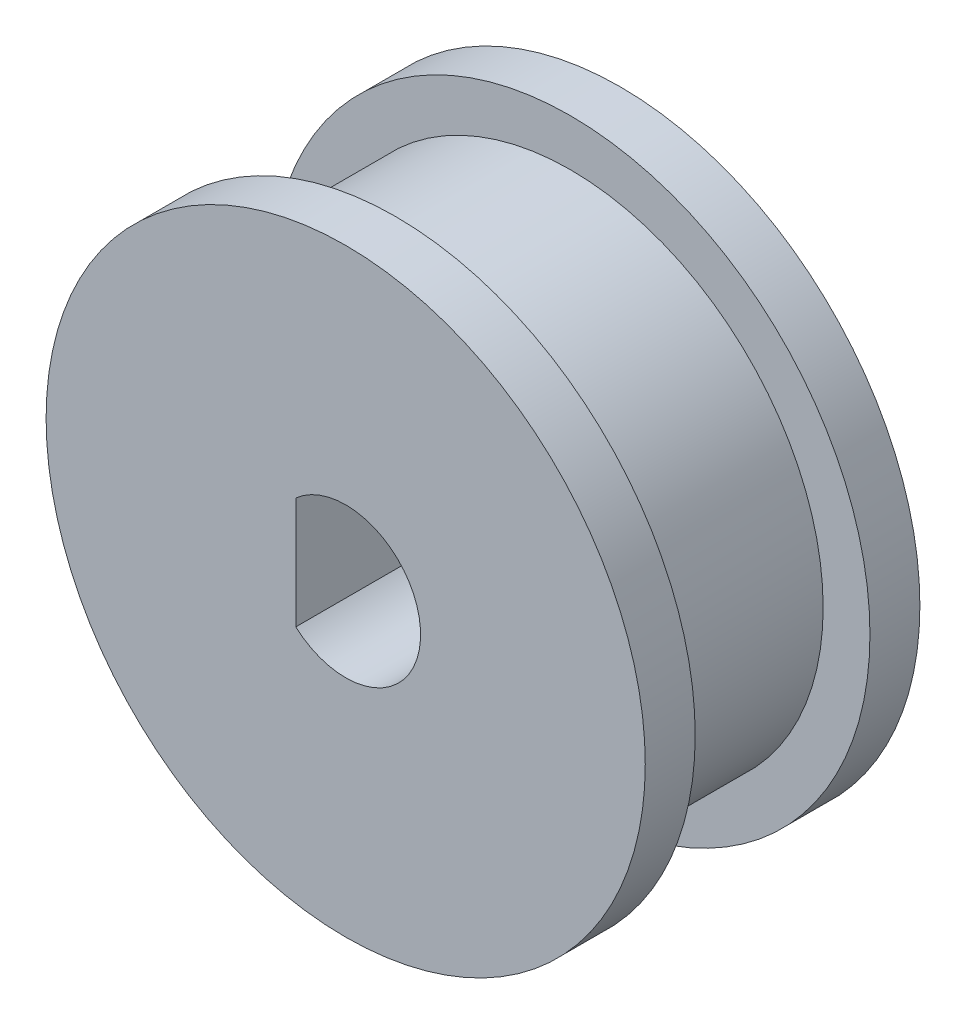
ISO-10303-21;
HEADER;
FILE_DESCRIPTION(('STEP AP214'),'2;1');
FILE_NAME('part.step','',(''),(''),'','','');
FILE_SCHEMA(('AUTOMOTIVE_DESIGN { 1 0 10303 214 1 1 1 1 }'));
ENDSEC;
DATA;
#1=APPLICATION_CONTEXT('core data for automotive mechanical design processes');
#2=APPLICATION_PROTOCOL_DEFINITION('international standard','automotive_design',2000,#1);
#3=PRODUCT_CONTEXT('',#1,'mechanical');
#4=PRODUCT('Part','Part','',(#3));
#5=PRODUCT_RELATED_PRODUCT_CATEGORY('part','',(#4));
#6=PRODUCT_DEFINITION_FORMATION('','',#4);
#7=PRODUCT_DEFINITION_CONTEXT('part definition',#1,'design');
#8=PRODUCT_DEFINITION('design','',#6,#7);
#9=PRODUCT_DEFINITION_SHAPE('','',#8);
#10=(LENGTH_UNIT() NAMED_UNIT(*) SI_UNIT(.MILLI.,.METRE.));
#11=(NAMED_UNIT(*) PLANE_ANGLE_UNIT() SI_UNIT($,.RADIAN.));
#12=(NAMED_UNIT(*) SI_UNIT($,.STERADIAN.) SOLID_ANGLE_UNIT());
#13=UNCERTAINTY_MEASURE_WITH_UNIT(LENGTH_MEASURE(1.E-05),#10,'distance_accuracy_value','');
#14=(GEOMETRIC_REPRESENTATION_CONTEXT(3) GLOBAL_UNCERTAINTY_ASSIGNED_CONTEXT((#13)) GLOBAL_UNIT_ASSIGNED_CONTEXT((#10,
#11,#12)) REPRESENTATION_CONTEXT('',''));
#15=CARTESIAN_POINT('',(0.,0.,0.));
#16=DIRECTION('',(0.,0.,1.));
#17=DIRECTION('',(1.,0.,0.));
#18=AXIS2_PLACEMENT_3D('',#15,#16,#17);
#19=CARTESIAN_POINT('',(0.,0.,3.5));
#20=DIRECTION('',(0.,0.,-1.));
#21=DIRECTION('',(-1.,0.,0.));
#22=AXIS2_PLACEMENT_3D('',#19,#20,#21);
#23=CYLINDRICAL_SURFACE('',#22,10.125);
#24=CARTESIAN_POINT('',(0.,-10.125,1.5));
#25=CARTESIAN_POINT('',(0.0837638113652493,-10.1249986690809,1.4999965364608));
#26=CARTESIAN_POINT('',(0.167576527266674,-10.1239496365079,1.49295993930032));
#27=CARTESIAN_POINT('',(0.332860107909288,-10.1198657946306,1.46500611770191));
#28=CARTESIAN_POINT('',(0.414328597579588,-10.1168290406185,1.44407529942512));
#29=CARTESIAN_POINT('',(0.572507755255597,-10.1091110862003,1.38897147390049));
#30=CARTESIAN_POINT('',(0.649221938171266,-10.1044311181231,1.35480838822025));
#31=CARTESIAN_POINT('',(0.795816796864536,-10.0939441396108,1.27423384307133));
#32=CARTESIAN_POINT('',(0.865698437520783,-10.0881372886587,1.2278241164839));
#33=CARTESIAN_POINT('',(0.997189526627415,-10.0759929611263,1.12369640264024));
#34=CARTESIAN_POINT('',(1.05873930827636,-10.0696521357657,1.06590345157246));
#35=CARTESIAN_POINT('',(1.17130478357067,-10.0571807833803,0.940811114197306));
#36=CARTESIAN_POINT('',(1.22231987716081,-10.0510502683515,0.873511186740605));
#37=CARTESIAN_POINT('',(1.31259935386314,-10.0396611330402,0.730915392536569));
#38=CARTESIAN_POINT('',(1.35180614707092,-10.034406839944,0.655582689202163));
#39=CARTESIAN_POINT('',(1.41698807406035,-10.0254106709424,0.49931062237877));
#40=CARTESIAN_POINT('',(1.44296391115152,-10.0216687146488,0.418371557163469));
#41=CARTESIAN_POINT('',(1.48076156498896,-10.0161537544874,0.253811248545279));
#42=CARTESIAN_POINT('',(1.49268543046269,-10.014366561579,0.170213928763024));
#43=CARTESIAN_POINT('',(1.50235677490334,-10.0129203791319,0.0021873130000883));
#44=CARTESIAN_POINT('',(1.50010504814121,-10.0132612703549,-0.0822419361022005));
#45=CARTESIAN_POINT('',(1.48157255204166,-10.01601976372,-0.248815669839024));
#46=CARTESIAN_POINT('',(1.46540533937245,-10.0184205556408,-0.330973106886233));
#47=CARTESIAN_POINT('',(1.41967851394471,-10.0250020854776,-0.491396128531784));
#48=CARTESIAN_POINT('',(1.39011853084709,-10.0291828726143,-0.569661605442587));
#49=CARTESIAN_POINT('',(1.31832684277617,-10.0388719316315,-0.720425121572834));
#50=CARTESIAN_POINT('',(1.27604693873346,-10.0443852368588,-0.79289987227854));
#51=CARTESIAN_POINT('',(1.18004991824751,-10.0561144642231,-0.929769053908086));
#52=CARTESIAN_POINT('',(1.12633206930943,-10.062330431347,-0.994162966908862));
#53=CARTESIAN_POINT('',(1.00836020058881,-10.0748389100312,-1.11370077783855));
#54=CARTESIAN_POINT('',(0.944008528396183,-10.0811315768469,-1.16874833202088));
#55=CARTESIAN_POINT('',(0.806928817458435,-10.0930280937204,-1.26727679323804));
#56=CARTESIAN_POINT('',(0.734200743644141,-10.0986319408942,-1.31075765184448));
#57=CARTESIAN_POINT('',(0.582349940447671,-10.1085250657243,-1.38492302245964));
#58=CARTESIAN_POINT('',(0.503223583282308,-10.1128135909035,-1.41560021327832));
#59=CARTESIAN_POINT('',(0.340864562425471,-10.1195865436355,-1.46320426122492));
#60=CARTESIAN_POINT('',(0.257632169847543,-10.1220710901317,-1.48013202491527));
#61=CARTESIAN_POINT('',(0.0902553766461194,-10.1249404149419,-1.49962885014899));
#62=CARTESIAN_POINT('',(0.00612672701644951,-10.1253445650426,-1.50233038587268));
#63=CARTESIAN_POINT('',(-0.161382384311351,-10.124060257838,-1.49364953410334));
#64=CARTESIAN_POINT('',(-0.244762868510274,-10.1223718636791,-1.48226757160584));
#65=CARTESIAN_POINT('',(-0.408008347122321,-10.117104163241,-1.44585296693453));
#66=CARTESIAN_POINT('',(-0.48788802662934,-10.1135337844542,-1.42088475536892));
#67=CARTESIAN_POINT('',(-0.642327306139718,-10.104901202049,-1.35807427665211));
#68=CARTESIAN_POINT('',(-0.71688666143652,-10.0998389298664,-1.32023141779688));
#69=CARTESIAN_POINT('',(-0.859152078466383,-10.0887371031823,-1.23243429509029));
#70=CARTESIAN_POINT('',(-0.926805666324396,-10.0826908586488,-1.18239586461557));
#71=CARTESIAN_POINT('',(-1.05280223392081,-10.0703151842522,-1.07174533800946));
#72=CARTESIAN_POINT('',(-1.11114468616479,-10.0639857383712,-1.01113264323176));
#73=CARTESIAN_POINT('',(-1.21734392495725,-10.0516957340842,-0.880464892598861));
#74=CARTESIAN_POINT('',(-1.26511198559047,-10.0457385774643,-0.810337356934592));
#75=CARTESIAN_POINT('',(-1.3481900599821,-10.0349275575465,-0.662976058004377));
#76=CARTESIAN_POINT('',(-1.38350040380324,-10.0300736650192,-0.585742483078749));
#77=CARTESIAN_POINT('',(-1.4405227057952,-10.0220432667678,-0.426627788295707));
#78=CARTESIAN_POINT('',(-1.46228162102523,-10.0188609748515,-0.344763801418272));
#79=CARTESIAN_POINT('',(-1.491733012766,-10.0145186092197,-0.178492869335527));
#80=CARTESIAN_POINT('',(-1.49942643478559,-10.0133583995762,-0.0940860954488826));
#81=CARTESIAN_POINT('',(-1.50050636915554,-10.0131965509632,0.0739901993020562));
#82=CARTESIAN_POINT('',(-1.49403237740492,-10.0141738653447,0.157658837065951));
#83=CARTESIAN_POINT('',(-1.46725990660619,-10.0181312446972,0.322703535168193));
#84=CARTESIAN_POINT('',(-1.44696144756782,-10.0211113067694,0.404079598824667));
#85=CARTESIAN_POINT('',(-1.3931651240166,-10.028731113209,0.562192133156529));
#86=CARTESIAN_POINT('',(-1.35967677019156,-10.0333696614888,0.638931900988818));
#87=CARTESIAN_POINT('',(-1.28046512251875,-10.0437852862523,0.7857262286719));
#88=CARTESIAN_POINT('',(-1.23474143492849,-10.0495623993743,0.855780573282172));
#89=CARTESIAN_POINT('',(-1.13184934701868,-10.0616719775735,0.98792457768452));
#90=CARTESIAN_POINT('',(-1.07457756951678,-10.0680091456143,1.04993332231593));
#91=CARTESIAN_POINT('',(-0.950433442596111,-10.0804853489398,1.16350978760627));
#92=CARTESIAN_POINT('',(-0.883558862617147,-10.0866243377841,1.2150750757095));
#93=CARTESIAN_POINT('',(-0.741686222732159,-10.0980500096474,1.30654714772199));
#94=CARTESIAN_POINT('',(-0.666646526866731,-10.103331946029,1.34638993522944));
#95=CARTESIAN_POINT('',(-0.510897957359262,-10.1124017542597,1.41284709898553));
#96=CARTESIAN_POINT('',(-0.43019507876428,-10.1161911787901,1.43947523016839));
#97=CARTESIAN_POINT('',(-0.290937991142248,-10.1209800941738,1.47267944614035));
#98=CARTESIAN_POINT('',(-0.233244968095915,-10.1224798489464,1.48290907213627));
#99=CARTESIAN_POINT('',(-0.117042583639427,-10.1244902609544,1.49657051851406));
#100=CARTESIAN_POINT('',(-0.0585332320113895,-10.1250009300317,1.50000242028318));
#101=CARTESIAN_POINT('',(0.,-10.125,1.5));
#102=B_SPLINE_CURVE_WITH_KNOTS('',3,(#24,#25,#26,#27,#28,#29,#30,#31,#32,#33,#34,#35,#36,#37,
#38,#39,#40,#41,#42,#43,#44,#45,#46,#47,#48,#49,#50,#51,#52,#53,#54,#55,#56,#57,#58,#59,#60,#61,
#62,#63,#64,#65,#66,#67,#68,#69,#70,#71,#72,#73,#74,#75,#76,#77,#78,#79,#80,#81,#82,#83,#84,#85,
#86,#87,#88,#89,#90,#91,#92,#93,#94,#95,#96,#97,#98,#99,#100,#101),.UNSPECIFIED.,.T.,.F.,(4,2,2,
2,2,2,2,2,2,2,2,2,2,2,2,2,2,2,2,2,2,2,2,2,2,2,2,2,2,2,2,2,2,2,2,2,2,2,4),(0.,0.251077554142502,
0.502401120508755,0.753536607868805,1.00463657897284,1.25744905426896,1.51027592577958,
1.76431659567471,2.01834376028179,2.27051452323561,2.5226711569646,2.77278937913918,
3.02291451804595,3.27399964581028,3.52510085809927,3.77865113545417,4.03220247437744,
4.28589859702827,4.53957799097868,4.79089089882474,5.0421962230253,5.29232002885766,
5.54245533164653,5.79436839552578,6.04629572572106,6.30026287771631,6.55422330043787,
6.80729875596697,7.06035719866375,7.31093518488099,7.56151280840874,7.81191008058056,
8.06231541169914,8.31507069785246,8.56788478982094,8.82205449054497,9.07595907208052,
9.25141141180508,9.42686165087542),.UNSPECIFIED.);
#103=CARTESIAN_POINT('',(0.,-10.125,1.5));
#104=VERTEX_POINT('',#103);
#105=EDGE_CURVE('E84',#104,#104,#102,.T.);
#106=ORIENTED_EDGE('',*,*,#105,.T.);
#107=EDGE_LOOP('',(#106));
#108=FACE_BOUND('',#107,.T.);
#109=CARTESIAN_POINT('',(0.,0.,3.5));
#110=DIRECTION('',(0.,0.,1.));
#111=DIRECTION('',(1.,0.,0.));
#112=AXIS2_PLACEMENT_3D('',#109,#110,#111);
#113=CIRCLE('',#112,10.125);
#114=CARTESIAN_POINT('',(10.125,0.,3.5));
#115=VERTEX_POINT('',#114);
#116=EDGE_CURVE('E11',#115,#115,#113,.T.);
#117=ORIENTED_EDGE('',*,*,#116,.F.);
#118=EDGE_LOOP('',(#117));
#119=FACE_BOUND('',#118,.T.);
#120=CARTESIAN_POINT('',(0.,0.,-3.5));
#121=DIRECTION('',(0.,0.,1.));
#122=DIRECTION('',(1.,0.,0.));
#123=AXIS2_PLACEMENT_3D('',#120,#121,#122);
#124=CIRCLE('',#123,10.125);
#125=CARTESIAN_POINT('',(10.125,0.,-3.5));
#126=VERTEX_POINT('',#125);
#127=EDGE_CURVE('E96',#126,#126,#124,.T.);
#128=ORIENTED_EDGE('',*,*,#127,.T.);
#129=EDGE_LOOP('',(#128));
#130=FACE_BOUND('',#129,.T.);
#131=ADVANCED_FACE('F36',(#108,#119,#130),#23,.T.);
#132=CARTESIAN_POINT('',(0.,0.,5.5));
#133=DIRECTION('',(0.,0.,-1.));
#134=DIRECTION('',(-1.,0.,0.));
#135=AXIS2_PLACEMENT_3D('',#132,#133,#134);
#136=CYLINDRICAL_SURFACE('',#135,12.);
#137=CARTESIAN_POINT('',(0.,0.,5.5));
#138=DIRECTION('',(0.,0.,1.));
#139=DIRECTION('',(1.,0.,0.));
#140=AXIS2_PLACEMENT_3D('',#137,#138,#139);
#141=CIRCLE('',#140,12.);
#142=CARTESIAN_POINT('',(12.,0.,5.5));
#143=VERTEX_POINT('',#142);
#144=EDGE_CURVE('E50',#143,#143,#141,.T.);
#145=ORIENTED_EDGE('',*,*,#144,.F.);
#146=EDGE_LOOP('',(#145));
#147=FACE_BOUND('',#146,.T.);
#148=CARTESIAN_POINT('',(0.,0.,3.5));
#149=DIRECTION('',(0.,0.,1.));
#150=DIRECTION('',(1.,0.,0.));
#151=AXIS2_PLACEMENT_3D('',#148,#149,#150);
#152=CIRCLE('',#151,12.);
#153=CARTESIAN_POINT('',(12.,0.,3.5));
#154=VERTEX_POINT('',#153);
#155=EDGE_CURVE('E101',#154,#154,#152,.T.);
#156=ORIENTED_EDGE('',*,*,#155,.T.);
#157=EDGE_LOOP('',(#156));
#158=FACE_BOUND('',#157,.T.);
#159=ADVANCED_FACE('F129',(#147,#158),#136,.T.);
#160=CARTESIAN_POINT('',(0.,0.,5.5));
#161=DIRECTION('',(0.,0.,1.));
#162=DIRECTION('',(1.,0.,0.));
#163=AXIS2_PLACEMENT_3D('',#160,#161,#162);
#164=PLANE('',#163);
#165=CARTESIAN_POINT('',(0.,0.,5.5));
#166=DIRECTION('',(0.,0.,1.));
#167=DIRECTION('',(1.,0.,0.));
#168=AXIS2_PLACEMENT_3D('',#165,#166,#167);
#169=CIRCLE('',#168,3.);
#170=CARTESIAN_POINT('',(-2.,-2.23606797749979,5.5));
#171=VERTEX_POINT('',#170);
#172=CARTESIAN_POINT('',(-2.,2.23606797749979,5.5));
#173=VERTEX_POINT('',#172);
#174=EDGE_CURVE('E58',#171,#173,#169,.T.);
#175=ORIENTED_EDGE('',*,*,#174,.F.);
#176=DIRECTION('',(0.,-1.,0.));
#177=VECTOR('',#176,1.);
#178=CARTESIAN_POINT('',(-2.,2.23606797749979,5.5));
#179=LINE('',#178,#177);
#180=EDGE_CURVE('E78',#173,#171,#179,.T.);
#181=ORIENTED_EDGE('',*,*,#180,.F.);
#182=EDGE_LOOP('',(#175,#181));
#183=FACE_BOUND('',#182,.T.);
#184=ORIENTED_EDGE('',*,*,#144,.T.);
#185=EDGE_LOOP('',(#184));
#186=FACE_BOUND('',#185,.T.);
#187=ADVANCED_FACE('F82',(#183,#186),#164,.T.);
#188=CARTESIAN_POINT('',(0.,0.,3.5));
#189=DIRECTION('',(0.,0.,1.));
#190=DIRECTION('',(1.,0.,0.));
#191=AXIS2_PLACEMENT_3D('',#188,#189,#190);
#192=PLANE('',#191);
#193=ORIENTED_EDGE('',*,*,#116,.T.);
#194=EDGE_LOOP('',(#193));
#195=FACE_BOUND('',#194,.T.);
#196=ORIENTED_EDGE('',*,*,#155,.F.);
#197=EDGE_LOOP('',(#196));
#198=FACE_BOUND('',#197,.T.);
#199=ADVANCED_FACE('F116',(#195,#198),#192,.F.);
#200=CARTESIAN_POINT('',(0.,0.,-5.5));
#201=DIRECTION('',(0.,0.,1.));
#202=DIRECTION('',(1.,0.,0.));
#203=AXIS2_PLACEMENT_3D('',#200,#201,#202);
#204=CYLINDRICAL_SURFACE('',#203,12.);
#205=CARTESIAN_POINT('',(0.,0.,-5.5));
#206=DIRECTION('',(0.,0.,1.));
#207=DIRECTION('',(1.,0.,0.));
#208=AXIS2_PLACEMENT_3D('',#205,#206,#207);
#209=CIRCLE('',#208,12.);
#210=CARTESIAN_POINT('',(12.,0.,-5.5));
#211=VERTEX_POINT('',#210);
#212=EDGE_CURVE('E93',#211,#211,#209,.T.);
#213=ORIENTED_EDGE('',*,*,#212,.T.);
#214=EDGE_LOOP('',(#213));
#215=FACE_BOUND('',#214,.T.);
#216=CARTESIAN_POINT('',(0.,0.,-3.5));
#217=DIRECTION('',(0.,0.,1.));
#218=DIRECTION('',(1.,0.,0.));
#219=AXIS2_PLACEMENT_3D('',#216,#217,#218);
#220=CIRCLE('',#219,12.);
#221=CARTESIAN_POINT('',(12.,0.,-3.5));
#222=VERTEX_POINT('',#221);
#223=EDGE_CURVE('E74',#222,#222,#220,.T.);
#224=ORIENTED_EDGE('',*,*,#223,.F.);
#225=EDGE_LOOP('',(#224));
#226=FACE_BOUND('',#225,.T.);
#227=ADVANCED_FACE('F114',(#215,#226),#204,.T.);
#228=CARTESIAN_POINT('',(0.,0.,-5.5));
#229=DIRECTION('',(0.,0.,-1.));
#230=DIRECTION('',(1.,0.,0.));
#231=AXIS2_PLACEMENT_3D('',#228,#229,#230);
#232=PLANE('',#231);
#233=CARTESIAN_POINT('',(0.,0.,-5.5));
#234=DIRECTION('',(0.,0.,1.));
#235=DIRECTION('',(1.,0.,0.));
#236=AXIS2_PLACEMENT_3D('',#233,#234,#235);
#237=CIRCLE('',#236,3.);
#238=CARTESIAN_POINT('',(-2.,-2.23606797749979,-5.5));
#239=VERTEX_POINT('',#238);
#240=CARTESIAN_POINT('',(-2.,2.23606797749979,-5.5));
#241=VERTEX_POINT('',#240);
#242=EDGE_CURVE('E63',#239,#241,#237,.T.);
#243=ORIENTED_EDGE('',*,*,#242,.T.);
#244=DIRECTION('',(0.,-1.,0.));
#245=VECTOR('',#244,1.);
#246=CARTESIAN_POINT('',(-2.,2.23606797749979,-5.5));
#247=LINE('',#246,#245);
#248=EDGE_CURVE('E89',#241,#239,#247,.T.);
#249=ORIENTED_EDGE('',*,*,#248,.T.);
#250=EDGE_LOOP('',(#243,#249));
#251=FACE_BOUND('',#250,.T.);
#252=ORIENTED_EDGE('',*,*,#212,.F.);
#253=EDGE_LOOP('',(#252));
#254=FACE_BOUND('',#253,.T.);
#255=ADVANCED_FACE('F110',(#251,#254),#232,.T.);
#256=CARTESIAN_POINT('',(0.,0.,-3.5));
#257=DIRECTION('',(0.,0.,-1.));
#258=DIRECTION('',(1.,0.,0.));
#259=AXIS2_PLACEMENT_3D('',#256,#257,#258);
#260=PLANE('',#259);
#261=ORIENTED_EDGE('',*,*,#127,.F.);
#262=EDGE_LOOP('',(#261));
#263=FACE_BOUND('',#262,.T.);
#264=ORIENTED_EDGE('',*,*,#223,.T.);
#265=EDGE_LOOP('',(#264));
#266=FACE_BOUND('',#265,.T.);
#267=ADVANCED_FACE('F107',(#263,#266),#260,.F.);
#268=CARTESIAN_POINT('',(0.,0.,-5.5));
#269=DIRECTION('',(0.,0.,1.));
#270=DIRECTION('',(1.,0.,0.));
#271=AXIS2_PLACEMENT_3D('',#268,#269,#270);
#272=CYLINDRICAL_SURFACE('',#271,3.);
#273=CARTESIAN_POINT('',(0.,-3.,1.5));
#274=CARTESIAN_POINT('',(-0.0788579444268501,-2.99999570107562,1.49999504652421));
#275=CARTESIAN_POINT('',(-0.157809899546344,-2.99685736529635,1.49374489031842));
#276=CARTESIAN_POINT('',(-0.313380352903344,-2.98461234055736,1.46902067948769));
#277=CARTESIAN_POINT('',(-0.389994130070444,-2.97549431743379,1.45052341050328));
#278=CARTESIAN_POINT('',(-0.538400317320673,-2.95224419105063,1.40220928707506));
#279=CARTESIAN_POINT('',(-0.610210204408719,-2.93813158766306,1.37243642362805));
#280=CARTESIAN_POINT('',(-0.747708925209898,-2.90618664773642,1.30264406795252));
#281=CARTESIAN_POINT('',(-0.813398240985088,-2.88835460450288,1.2626253836267));
#282=CARTESIAN_POINT('',(-0.941261726642863,-2.84934387387093,1.17072412577207));
#283=CARTESIAN_POINT('',(-1.00298281668316,-2.82802798691306,1.11827028114054));
#284=CARTESIAN_POINT('',(-1.11716916730047,-2.78489955370115,1.00421778112945));
#285=CARTESIAN_POINT('',(-1.16962737466015,-2.76308664313552,0.942612222341339));
#286=CARTESIAN_POINT('',(-1.26787800067542,-2.71948426796021,0.806274975714929));
#287=CARTESIAN_POINT('',(-1.31283800332746,-2.69782780455198,0.730895852481132));
#288=CARTESIAN_POINT('',(-1.38925234033604,-2.65928968158481,0.572448996020679));
#289=CARTESIAN_POINT('',(-1.4207163224495,-2.64240461410484,0.489386806915877));
#290=CARTESIAN_POINT('',(-1.46719866328288,-2.61686800556713,0.323002341867117));
#291=CARTESIAN_POINT('',(-1.48308878562066,-2.6077840737557,0.23999332189891));
#292=CARTESIAN_POINT('',(-1.50064048996327,-2.59772834922792,0.0720317433307853));
#293=CARTESIAN_POINT('',(-1.50231613255961,-2.59674854014932,-0.0129188113067316));
#294=CARTESIAN_POINT('',(-1.49203093075844,-2.60266395385873,-0.171429036473052));
#295=CARTESIAN_POINT('',(-1.48167683930523,-2.6086314549302,-0.245136046834575));
#296=CARTESIAN_POINT('',(-1.4504097735854,-2.62614343100776,-0.389582864059563));
#297=CARTESIAN_POINT('',(-1.42949343584648,-2.63768968247664,-0.460321717957974));
#298=CARTESIAN_POINT('',(-1.37731467057901,-2.66531214619112,-0.598843698848489));
#299=CARTESIAN_POINT('',(-1.34582260067399,-2.68148760995998,-0.666519598178684));
#300=CARTESIAN_POINT('',(-1.273562531502,-2.71655106422106,-0.795951438885013));
#301=CARTESIAN_POINT('',(-1.2327903657187,-2.73544027170286,-0.857704703400134));
#302=CARTESIAN_POINT('',(-1.13709908236918,-2.77669736854929,-0.98178187911484));
#303=CARTESIAN_POINT('',(-1.08104168755392,-2.79920265355119,-1.04318531036424));
#304=CARTESIAN_POINT('',(-0.95933336811206,-2.84321434950611,-1.15610312788635));
#305=CARTESIAN_POINT('',(-0.893677884861428,-2.86472027938201,-1.20761278805082));
#306=CARTESIAN_POINT('',(-0.750774758747772,-2.90552980924446,-1.30152849154459));
#307=CARTESIAN_POINT('',(-0.673130387399113,-2.92468476243011,-1.34340070866861));
#308=CARTESIAN_POINT('',(-0.510699323233194,-2.95736821681863,-1.41314554356451));
#309=CARTESIAN_POINT('',(-0.425918364397913,-2.9709011841533,-1.44102927752275));
#310=CARTESIAN_POINT('',(-0.259149737491053,-2.98986500612153,-1.47971310557502));
#311=CARTESIAN_POINT('',(-0.177512295822489,-2.99587407451965,-1.49173685362017));
#312=CARTESIAN_POINT('',(-0.0131693999240273,-3.00109520188655,-1.50219709670173));
#313=CARTESIAN_POINT('',(0.0695355298048633,-3.00031048081978,-1.5006400284592));
#314=CARTESIAN_POINT('',(0.22684945797898,-2.99236788380153,-1.48468996737188));
#315=CARTESIAN_POINT('',(0.301589112074895,-2.98570868532253,-1.47130120090501));
#316=CARTESIAN_POINT('',(0.447610338452911,-2.9673325697226,-1.43364289215732));
#317=CARTESIAN_POINT('',(0.51889152853663,-2.95561509501618,-1.40937215031976));
#318=CARTESIAN_POINT('',(0.658332912674359,-2.92776377120382,-1.35000230035045));
#319=CARTESIAN_POINT('',(0.726345595508705,-2.91151322654446,-1.31461342482557));
#320=CARTESIAN_POINT('',(0.855692042548907,-2.87615961476126,-1.23433869653015));
#321=CARTESIAN_POINT('',(0.917022944664887,-2.85705533350408,-1.18944879810691));
#322=CARTESIAN_POINT('',(1.03765153393382,-2.81562332004297,-1.08635936200393));
#323=CARTESIAN_POINT('',(1.09615811672854,-2.79316327265249,-1.02728569733228));
#324=CARTESIAN_POINT('',(1.20278448167828,-2.7489358741323,-0.900112273083409));
#325=CARTESIAN_POINT('',(1.25089707856781,-2.72716901100071,-0.832006321728121));
#326=CARTESIAN_POINT('',(1.33756187171853,-2.68576788309734,-0.684534518740537));
#327=CARTESIAN_POINT('',(1.37553824370037,-2.66628794383591,-0.604783100858278));
#328=CARTESIAN_POINT('',(1.43712423890206,-2.63361108441202,-0.438734898637552));
#329=CARTESIAN_POINT('',(1.46075237380052,-2.62040607332625,-0.352446710299665));
#330=CARTESIAN_POINT('',(1.49079253120031,-2.60342251538703,-0.184634665672944));
#331=CARTESIAN_POINT('',(1.49863949460818,-2.59886075197597,-0.103448619847138));
#332=CARTESIAN_POINT('',(1.5010337315643,-2.59748031962405,0.0591706007467869));
#333=CARTESIAN_POINT('',(1.49558676993486,-2.60065829439585,0.140603653106792));
#334=CARTESIAN_POINT('',(1.47288918838996,-2.61356793076615,0.293225252300156));
#335=CARTESIAN_POINT('',(1.45681247151455,-2.62264641723988,0.364650705217109));
#336=CARTESIAN_POINT('',(1.41476303733662,-2.64556524281479,0.50371217913655));
#337=CARTESIAN_POINT('',(1.38878713673988,-2.65940711354503,0.571346973138048));
#338=CARTESIAN_POINT('',(1.32572361795085,-2.69142795546804,0.705937276479806));
#339=CARTESIAN_POINT('',(1.28800670672355,-2.70983583593881,0.772541852743542));
#340=CARTESIAN_POINT('',(1.20322645745609,-2.74852997452291,0.898911804271888));
#341=CARTESIAN_POINT('',(1.15615825686234,-2.76881720693416,0.958673595781668));
#342=CARTESIAN_POINT('',(1.04730498999206,-2.81193484737138,1.07721297353201));
#343=CARTESIAN_POINT('',(0.984426634495891,-2.83477474959942,1.13498865352544));
#344=CARTESIAN_POINT('',(0.849232209349795,-2.87816628389896,1.2393944751529));
#345=CARTESIAN_POINT('',(0.776911084957795,-2.89871667939293,1.28601860920486));
#346=CARTESIAN_POINT('',(0.623897395174417,-2.93547014349806,1.36685454406811));
#347=CARTESIAN_POINT('',(0.543149255665095,-2.95164144740899,1.4009762538547));
#348=CARTESIAN_POINT('',(0.376113151707129,-2.9775201194848,1.45471225163611));
#349=CARTESIAN_POINT('',(0.289841699383649,-2.98724585044602,1.47436777020857));
#350=CARTESIAN_POINT('',(0.168902919736342,-2.99543192870217,1.49084611662861));
#351=CARTESIAN_POINT('',(0.135242819162346,-2.99714048010376,1.49427396129951));
#352=CARTESIAN_POINT('',(0.0677275977076369,-2.99942545465223,1.49885199827113));
#353=CARTESIAN_POINT('',(0.0338724714699424,-3.00000184655071,1.50000212770531));
#354=CARTESIAN_POINT('',(0.,-3.,1.5));
#355=B_SPLINE_CURVE_WITH_KNOTS('',3,(#273,#274,#275,#276,#277,#278,#279,#280,#281,#282,#283,
#284,#285,#286,#287,#288,#289,#290,#291,#292,#293,#294,#295,#296,#297,#298,#299,#300,#301,#302,
#303,#304,#305,#306,#307,#308,#309,#310,#311,#312,#313,#314,#315,#316,#317,#318,#319,#320,#321,
#322,#323,#324,#325,#326,#327,#328,#329,#330,#331,#332,#333,#334,#335,#336,#337,#338,#339,#340,
#341,#342,#343,#344,#345,#346,#347,#348,#349,#350,#351,#352,#353,#354),.UNSPECIFIED.,.T.,.F.,(4,
2,2,2,2,2,2,2,2,2,2,2,2,2,2,2,2,2,2,2,2,2,2,2,2,2,2,2,2,2,2,2,2,2,2,2,2,2,2,2,4),(0.,
0.236436386130439,0.473322224563796,0.709293233238447,0.945245640872351,1.19547263807713,
1.44588935648105,1.71572589646129,1.98536921847421,2.23887018210344,2.49212035993531,
2.71508568613981,2.93812205888518,3.16635360252731,3.39468781890333,3.65197412000818,
3.9093830189803,4.17874533321661,4.44789325368419,4.69474935707018,4.94148846767214,
5.16910359759183,5.39674382446397,5.63089284041848,5.86514176122509,6.12239415966628,
6.37982382923148,6.64972023242589,6.91926767918176,7.1629396125457,7.40650589797018,
7.62686895373284,7.84730293182527,8.08254685170431,8.31791341715446,8.58187864135758,
8.84598575071869,9.1119602049529,9.37717362931724,9.47872920200876,9.58028757766599),.UNSPECIFIED.);
#356=CARTESIAN_POINT('',(0.,-3.,1.5));
#357=VERTEX_POINT('',#356);
#358=EDGE_CURVE('E40',#357,#357,#355,.T.);
#359=ORIENTED_EDGE('',*,*,#358,.T.);
#360=EDGE_LOOP('',(#359));
#361=FACE_BOUND('',#360,.T.);
#362=ORIENTED_EDGE('',*,*,#174,.T.);
#363=DIRECTION('',(0.,0.,1.));
#364=VECTOR('',#363,1.);
#365=CARTESIAN_POINT('',(-2.,2.23606797749979,-5.5));
#366=LINE('',#365,#364);
#367=EDGE_CURVE('E75',#241,#173,#366,.T.);
#368=ORIENTED_EDGE('',*,*,#367,.F.);
#369=ORIENTED_EDGE('',*,*,#242,.F.);
#370=DIRECTION('',(0.,0.,1.));
#371=VECTOR('',#370,1.);
#372=CARTESIAN_POINT('',(-2.,-2.23606797749979,-5.5));
#373=LINE('',#372,#371);
#374=EDGE_CURVE('E68',#239,#171,#373,.T.);
#375=ORIENTED_EDGE('',*,*,#374,.T.);
#376=EDGE_LOOP('',(#362,#368,#369,#375));
#377=FACE_BOUND('',#376,.T.);
#378=ADVANCED_FACE('F70',(#361,#377),#272,.F.);
#379=CARTESIAN_POINT('',(-2.,2.23606797749979,-5.5));
#380=DIRECTION('',(-1.,0.,0.));
#381=DIRECTION('',(0.,0.,1.));
#382=AXIS2_PLACEMENT_3D('',#379,#380,#381);
#383=PLANE('',#382);
#384=ORIENTED_EDGE('',*,*,#180,.T.);
#385=ORIENTED_EDGE('',*,*,#374,.F.);
#386=ORIENTED_EDGE('',*,*,#248,.F.);
#387=ORIENTED_EDGE('',*,*,#367,.T.);
#388=EDGE_LOOP('',(#384,#385,#386,#387));
#389=FACE_BOUND('',#388,.T.);
#390=ADVANCED_FACE('F79',(#389),#383,.F.);
#391=CARTESIAN_POINT('',(0.,-12.,0.));
#392=DIRECTION('',(0.,1.,0.));
#393=DIRECTION('',(0.,0.,1.));
#394=AXIS2_PLACEMENT_3D('',#391,#392,#393);
#395=CYLINDRICAL_SURFACE('',#394,1.5);
#396=ORIENTED_EDGE('',*,*,#358,.F.);
#397=EDGE_LOOP('',(#396));
#398=FACE_BOUND('',#397,.T.);
#399=ORIENTED_EDGE('',*,*,#105,.F.);
#400=EDGE_LOOP('',(#399));
#401=FACE_BOUND('',#400,.T.);
#402=ADVANCED_FACE('F142',(#398,#401),#395,.F.);
#403=CLOSED_SHELL('',(#131,#159,#187,#199,#227,#255,#267,#378,#390,#402));
#404=MANIFOLD_SOLID_BREP('B2',#403);
#405=ADVANCED_BREP_SHAPE_REPRESENTATION('',(#18,#404),#14);
#406=SHAPE_DEFINITION_REPRESENTATION(#9,#405);
ENDSEC;
END-ISO-10303-21;
